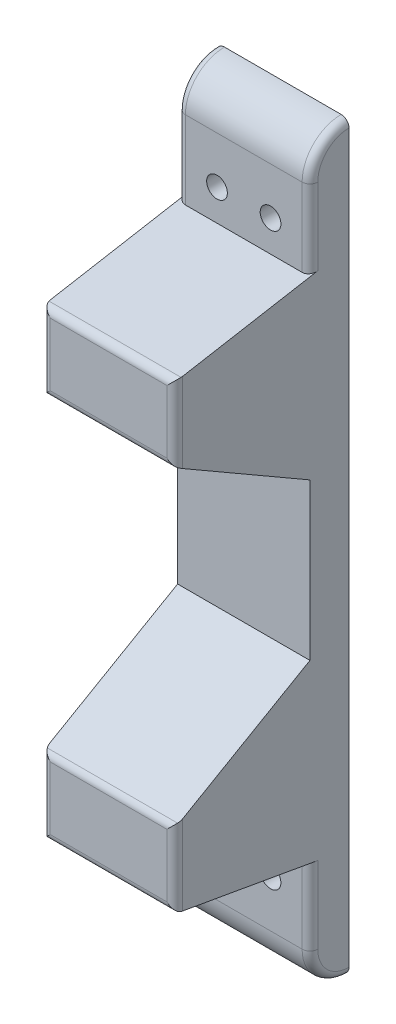
ISO-10303-21;
HEADER;
FILE_DESCRIPTION(('STEP AP214'),'2;1');
FILE_NAME('part.step','',(''),(''),'','','');
FILE_SCHEMA(('AUTOMOTIVE_DESIGN { 1 0 10303 214 1 1 1 1 }'));
ENDSEC;
DATA;
#1=APPLICATION_CONTEXT('core data for automotive mechanical design processes');
#2=APPLICATION_PROTOCOL_DEFINITION('international standard','automotive_design',2000,#1);
#3=PRODUCT_CONTEXT('',#1,'mechanical');
#4=PRODUCT('Part','Part','',(#3));
#5=PRODUCT_RELATED_PRODUCT_CATEGORY('part','',(#4));
#6=PRODUCT_DEFINITION_FORMATION('','',#4);
#7=PRODUCT_DEFINITION_CONTEXT('part definition',#1,'design');
#8=PRODUCT_DEFINITION('design','',#6,#7);
#9=PRODUCT_DEFINITION_SHAPE('','',#8);
#10=(LENGTH_UNIT() NAMED_UNIT(*) SI_UNIT(.MILLI.,.METRE.));
#11=(NAMED_UNIT(*) PLANE_ANGLE_UNIT() SI_UNIT($,.RADIAN.));
#12=(NAMED_UNIT(*) SI_UNIT($,.STERADIAN.) SOLID_ANGLE_UNIT());
#13=UNCERTAINTY_MEASURE_WITH_UNIT(LENGTH_MEASURE(1.E-05),#10,'distance_accuracy_value','');
#14=(GEOMETRIC_REPRESENTATION_CONTEXT(3) GLOBAL_UNCERTAINTY_ASSIGNED_CONTEXT((#13)) GLOBAL_UNIT_ASSIGNED_CONTEXT((#10,
#11,#12)) REPRESENTATION_CONTEXT('',''));
#15=CARTESIAN_POINT('',(0.,0.,0.));
#16=DIRECTION('',(0.,0.,1.));
#17=DIRECTION('',(1.,0.,0.));
#18=AXIS2_PLACEMENT_3D('',#15,#16,#17);
#19=CARTESIAN_POINT('',(0.,0.,10.));
#20=DIRECTION('',(0.,0.,-1.));
#21=DIRECTION('',(-1.,0.,0.));
#22=AXIS2_PLACEMENT_3D('',#19,#20,#21);
#23=PLANE('',#22);
#24=CARTESIAN_POINT('',(-6.85,-73.,10.));
#25=DIRECTION('',(0.,0.,1.));
#26=DIRECTION('',(-1.,0.,0.));
#27=AXIS2_PLACEMENT_3D('',#24,#25,#26);
#28=CIRCLE('',#27,2.65000000000001);
#29=CARTESIAN_POINT('',(-9.50000000000001,-73.,10.));
#30=VERTEX_POINT('',#29);
#31=EDGE_CURVE('E271',#30,#30,#28,.T.);
#32=ORIENTED_EDGE('',*,*,#31,.F.);
#33=EDGE_LOOP('',(#32));
#34=FACE_BOUND('',#33,.T.);
#35=CARTESIAN_POINT('',(6.85,-73.,10.));
#36=DIRECTION('',(0.,0.,1.));
#37=DIRECTION('',(1.,0.,0.));
#38=AXIS2_PLACEMENT_3D('',#35,#36,#37);
#39=CIRCLE('',#38,2.65000000000001);
#40=CARTESIAN_POINT('',(9.50000000000001,-73.,10.));
#41=VERTEX_POINT('',#40);
#42=EDGE_CURVE('E260',#41,#41,#39,.T.);
#43=ORIENTED_EDGE('',*,*,#42,.F.);
#44=EDGE_LOOP('',(#43));
#45=FACE_BOUND('',#44,.T.);
#46=DIRECTION('',(1.,0.,0.));
#47=VECTOR('',#46,1.);
#48=CARTESIAN_POINT('',(0.,-85.,10.));
#49=LINE('',#48,#47);
#50=CARTESIAN_POINT('',(-14.9328045684474,-85.,10.));
#51=VERTEX_POINT('',#50);
#52=CARTESIAN_POINT('',(14.9328045684475,-85.,10.));
#53=VERTEX_POINT('',#52);
#54=EDGE_CURVE('E315',#51,#53,#49,.T.);
#55=ORIENTED_EDGE('',*,*,#54,.T.);
#56=DIRECTION('',(0.,1.,0.));
#57=VECTOR('',#56,1.);
#58=CARTESIAN_POINT('',(14.9328045684475,0.,10.));
#59=LINE('',#58,#57);
#60=CARTESIAN_POINT('',(14.9328045684475,-65.,10.));
#61=VERTEX_POINT('',#60);
#62=EDGE_CURVE('E453',#53,#61,#59,.T.);
#63=ORIENTED_EDGE('',*,*,#62,.T.);
#64=DIRECTION('',(-1.,0.,0.));
#65=VECTOR('',#64,1.);
#66=CARTESIAN_POINT('',(16.9328045684475,-65.,10.));
#67=LINE('',#66,#65);
#68=CARTESIAN_POINT('',(-14.9328045684474,-65.,10.));
#69=VERTEX_POINT('',#68);
#70=EDGE_CURVE('E235',#61,#69,#67,.T.);
#71=ORIENTED_EDGE('',*,*,#70,.T.);
#72=DIRECTION('',(0.,-1.,0.));
#73=VECTOR('',#72,1.);
#74=CARTESIAN_POINT('',(-14.9328045684475,0.,10.));
#75=LINE('',#74,#73);
#76=EDGE_CURVE('E450',#69,#51,#75,.T.);
#77=ORIENTED_EDGE('',*,*,#76,.T.);
#78=EDGE_LOOP('',(#55,#63,#71,#77));
#79=FACE_BOUND('',#78,.T.);
#80=ADVANCED_FACE('F47',(#34,#45,#79),#23,.F.);
#81=DIRECTION('',(0.,-1.,0.));
#82=VECTOR('',#81,1.);
#83=CARTESIAN_POINT('',(-16.9328045684474,-95.,10.));
#84=LINE('',#83,#82);
#85=CARTESIAN_POINT('',(-16.9328045684475,20.,10.));
#86=VERTEX_POINT('',#85);
#87=CARTESIAN_POINT('',(-16.9328045684475,-20.,10.));
#88=VERTEX_POINT('',#87);
#89=EDGE_CURVE('E238',#86,#88,#84,.T.);
#90=ORIENTED_EDGE('',*,*,#89,.T.);
#91=DIRECTION('',(-1.,0.,0.));
#92=VECTOR('',#91,1.);
#93=CARTESIAN_POINT('',(16.9328045684475,-20.,10.));
#94=LINE('',#93,#92);
#95=CARTESIAN_POINT('',(16.9328045684475,-20.,10.));
#96=VERTEX_POINT('',#95);
#97=EDGE_CURVE('E537',#96,#88,#94,.T.);
#98=ORIENTED_EDGE('',*,*,#97,.F.);
#99=DIRECTION('',(0.,1.,0.));
#100=VECTOR('',#99,1.);
#101=CARTESIAN_POINT('',(16.9328045684475,-95.,10.));
#102=LINE('',#101,#100);
#103=CARTESIAN_POINT('',(16.9328045684475,20.,10.));
#104=VERTEX_POINT('',#103);
#105=EDGE_CURVE('E248',#96,#104,#102,.T.);
#106=ORIENTED_EDGE('',*,*,#105,.T.);
#107=DIRECTION('',(-1.,0.,0.));
#108=VECTOR('',#107,1.);
#109=CARTESIAN_POINT('',(16.9328045684475,20.,10.));
#110=LINE('',#109,#108);
#111=EDGE_CURVE('E227',#104,#86,#110,.T.);
#112=ORIENTED_EDGE('',*,*,#111,.T.);
#113=EDGE_LOOP('',(#90,#98,#106,#112));
#114=FACE_BOUND('',#113,.T.);
#115=ADVANCED_FACE('F251',(#114),#23,.F.);
#116=CARTESIAN_POINT('',(6.85,73.,10.));
#117=DIRECTION('',(0.,0.,1.));
#118=DIRECTION('',(-1.,0.,0.));
#119=AXIS2_PLACEMENT_3D('',#116,#117,#118);
#120=CIRCLE('',#119,2.65);
#121=CARTESIAN_POINT('',(4.2,73.,10.));
#122=VERTEX_POINT('',#121);
#123=EDGE_CURVE('E279',#122,#122,#120,.T.);
#124=ORIENTED_EDGE('',*,*,#123,.F.);
#125=EDGE_LOOP('',(#124));
#126=FACE_BOUND('',#125,.T.);
#127=CARTESIAN_POINT('',(-6.85,73.,10.));
#128=DIRECTION('',(0.,0.,1.));
#129=DIRECTION('',(1.,0.,0.));
#130=AXIS2_PLACEMENT_3D('',#127,#128,#129);
#131=CIRCLE('',#130,2.65);
#132=CARTESIAN_POINT('',(-4.2,73.,10.));
#133=VERTEX_POINT('',#132);
#134=EDGE_CURVE('E287',#133,#133,#131,.T.);
#135=ORIENTED_EDGE('',*,*,#134,.F.);
#136=EDGE_LOOP('',(#135));
#137=FACE_BOUND('',#136,.T.);
#138=DIRECTION('',(-1.,0.,0.));
#139=VECTOR('',#138,1.);
#140=CARTESIAN_POINT('',(0.,85.,10.));
#141=LINE('',#140,#139);
#142=CARTESIAN_POINT('',(14.9328045684475,85.,10.));
#143=VERTEX_POINT('',#142);
#144=CARTESIAN_POINT('',(-14.9328045684475,85.,10.));
#145=VERTEX_POINT('',#144);
#146=EDGE_CURVE('E247',#143,#145,#141,.T.);
#147=ORIENTED_EDGE('',*,*,#146,.T.);
#148=DIRECTION('',(0.,-1.,0.));
#149=VECTOR('',#148,1.);
#150=CARTESIAN_POINT('',(-14.9328045684475,0.,10.));
#151=LINE('',#150,#149);
#152=CARTESIAN_POINT('',(-14.9328045684475,65.,10.));
#153=VERTEX_POINT('',#152);
#154=EDGE_CURVE('E388',#145,#153,#151,.T.);
#155=ORIENTED_EDGE('',*,*,#154,.T.);
#156=DIRECTION('',(-1.,0.,0.));
#157=VECTOR('',#156,1.);
#158=CARTESIAN_POINT('',(16.9328045684475,65.,10.));
#159=LINE('',#158,#157);
#160=CARTESIAN_POINT('',(14.9328045684475,65.,10.));
#161=VERTEX_POINT('',#160);
#162=EDGE_CURVE('E255',#161,#153,#159,.T.);
#163=ORIENTED_EDGE('',*,*,#162,.F.);
#164=DIRECTION('',(0.,1.,0.));
#165=VECTOR('',#164,1.);
#166=CARTESIAN_POINT('',(14.9328045684475,0.,10.));
#167=LINE('',#166,#165);
#168=EDGE_CURVE('E385',#161,#143,#167,.T.);
#169=ORIENTED_EDGE('',*,*,#168,.T.);
#170=EDGE_LOOP('',(#147,#155,#163,#169));
#171=FACE_BOUND('',#170,.T.);
#172=ADVANCED_FACE('F629',(#126,#137,#171),#23,.F.);
#173=CARTESIAN_POINT('',(0.,0.,0.));
#174=DIRECTION('',(0.,0.,-1.));
#175=DIRECTION('',(-1.,0.,0.));
#176=AXIS2_PLACEMENT_3D('',#173,#174,#175);
#177=PLANE('',#176);
#178=CARTESIAN_POINT('',(-6.85,-73.,0.));
#179=DIRECTION('',(0.,0.,1.));
#180=DIRECTION('',(-1.,0.,0.));
#181=AXIS2_PLACEMENT_3D('',#178,#179,#180);
#182=CIRCLE('',#181,2.65000000000001);
#183=CARTESIAN_POINT('',(-9.50000000000001,-73.,0.));
#184=VERTEX_POINT('',#183);
#185=EDGE_CURVE('E269',#184,#184,#182,.T.);
#186=ORIENTED_EDGE('',*,*,#185,.T.);
#187=EDGE_LOOP('',(#186));
#188=FACE_BOUND('',#187,.T.);
#189=CARTESIAN_POINT('',(-6.85,73.,0.));
#190=DIRECTION('',(0.,0.,1.));
#191=DIRECTION('',(1.,0.,0.));
#192=AXIS2_PLACEMENT_3D('',#189,#190,#191);
#193=CIRCLE('',#192,2.65);
#194=CARTESIAN_POINT('',(-4.2,73.,0.));
#195=VERTEX_POINT('',#194);
#196=EDGE_CURVE('E283',#195,#195,#193,.T.);
#197=ORIENTED_EDGE('',*,*,#196,.T.);
#198=EDGE_LOOP('',(#197));
#199=FACE_BOUND('',#198,.T.);
#200=DIRECTION('',(0.,-1.,0.));
#201=VECTOR('',#200,1.);
#202=CARTESIAN_POINT('',(-16.9328045684474,-95.,0.));
#203=LINE('',#202,#201);
#204=CARTESIAN_POINT('',(-16.9328045684475,93.,0.));
#205=VERTEX_POINT('',#204);
#206=CARTESIAN_POINT('',(-16.9328045684474,-93.,0.));
#207=VERTEX_POINT('',#206);
#208=EDGE_CURVE('E305',#205,#207,#203,.T.);
#209=ORIENTED_EDGE('',*,*,#208,.F.);
#210=CARTESIAN_POINT('',(-14.9328045684475,93.,0.));
#211=DIRECTION('',(0.,0.,-1.));
#212=DIRECTION('',(-1.,0.,0.));
#213=AXIS2_PLACEMENT_3D('',#210,#211,#212);
#214=CIRCLE('',#213,2.);
#215=CARTESIAN_POINT('',(-14.9328045684475,95.,0.));
#216=VERTEX_POINT('',#215);
#217=EDGE_CURVE('E349',#205,#216,#214,.T.);
#218=ORIENTED_EDGE('',*,*,#217,.T.);
#219=DIRECTION('',(-1.,0.,0.));
#220=VECTOR('',#219,1.);
#221=CARTESIAN_POINT('',(-16.9328045684475,95.,0.));
#222=LINE('',#221,#220);
#223=CARTESIAN_POINT('',(14.9328045684475,95.,0.));
#224=VERTEX_POINT('',#223);
#225=EDGE_CURVE('E301',#224,#216,#222,.T.);
#226=ORIENTED_EDGE('',*,*,#225,.F.);
#227=CARTESIAN_POINT('',(14.9328045684475,93.,0.));
#228=DIRECTION('',(0.,0.,-1.));
#229=DIRECTION('',(-1.,0.,0.));
#230=AXIS2_PLACEMENT_3D('',#227,#228,#229);
#231=CIRCLE('',#230,2.);
#232=CARTESIAN_POINT('',(16.9328045684475,93.,0.));
#233=VERTEX_POINT('',#232);
#234=EDGE_CURVE('E346',#224,#233,#231,.T.);
#235=ORIENTED_EDGE('',*,*,#234,.T.);
#236=DIRECTION('',(0.,1.,0.));
#237=VECTOR('',#236,1.);
#238=CARTESIAN_POINT('',(16.9328045684475,-95.,0.));
#239=LINE('',#238,#237);
#240=CARTESIAN_POINT('',(16.9328045684475,-93.,0.));
#241=VERTEX_POINT('',#240);
#242=EDGE_CURVE('E291',#241,#233,#239,.T.);
#243=ORIENTED_EDGE('',*,*,#242,.F.);
#244=CARTESIAN_POINT('',(14.9328045684475,-93.,0.));
#245=DIRECTION('',(0.,0.,-1.));
#246=DIRECTION('',(-1.,0.,0.));
#247=AXIS2_PLACEMENT_3D('',#244,#245,#246);
#248=CIRCLE('',#247,2.);
#249=CARTESIAN_POINT('',(14.9328045684475,-95.,0.));
#250=VERTEX_POINT('',#249);
#251=EDGE_CURVE('E343',#241,#250,#248,.T.);
#252=ORIENTED_EDGE('',*,*,#251,.T.);
#253=DIRECTION('',(1.,0.,0.));
#254=VECTOR('',#253,1.);
#255=CARTESIAN_POINT('',(-16.9328045684474,-95.,0.));
#256=LINE('',#255,#254);
#257=CARTESIAN_POINT('',(-14.9328045684474,-95.,0.));
#258=VERTEX_POINT('',#257);
#259=EDGE_CURVE('E296',#258,#250,#256,.T.);
#260=ORIENTED_EDGE('',*,*,#259,.F.);
#261=CARTESIAN_POINT('',(-14.9328045684474,-93.,0.));
#262=DIRECTION('',(0.,0.,-1.));
#263=DIRECTION('',(-1.,0.,0.));
#264=AXIS2_PLACEMENT_3D('',#261,#262,#263);
#265=CIRCLE('',#264,2.);
#266=EDGE_CURVE('E340',#258,#207,#265,.T.);
#267=ORIENTED_EDGE('',*,*,#266,.T.);
#268=EDGE_LOOP('',(#209,#218,#226,#235,#243,#252,#260,#267));
#269=FACE_BOUND('',#268,.T.);
#270=CARTESIAN_POINT('',(6.85,73.,0.));
#271=DIRECTION('',(0.,0.,1.));
#272=DIRECTION('',(-1.,0.,0.));
#273=AXIS2_PLACEMENT_3D('',#270,#271,#272);
#274=CIRCLE('',#273,2.65);
#275=CARTESIAN_POINT('',(4.2,73.,0.));
#276=VERTEX_POINT('',#275);
#277=EDGE_CURVE('E275',#276,#276,#274,.T.);
#278=ORIENTED_EDGE('',*,*,#277,.T.);
#279=EDGE_LOOP('',(#278));
#280=FACE_BOUND('',#279,.T.);
#281=CARTESIAN_POINT('',(6.85,-73.,0.));
#282=DIRECTION('',(0.,0.,1.));
#283=DIRECTION('',(1.,0.,0.));
#284=AXIS2_PLACEMENT_3D('',#281,#282,#283);
#285=CIRCLE('',#284,2.65000000000001);
#286=CARTESIAN_POINT('',(9.50000000000001,-73.,0.));
#287=VERTEX_POINT('',#286);
#288=EDGE_CURVE('E254',#287,#287,#285,.T.);
#289=ORIENTED_EDGE('',*,*,#288,.T.);
#290=EDGE_LOOP('',(#289));
#291=FACE_BOUND('',#290,.T.);
#292=ADVANCED_FACE('F593',(#188,#199,#269,#280,#291),#177,.T.);
#293=CARTESIAN_POINT('',(16.9328045684475,-95.,10.));
#294=DIRECTION('',(-1.,0.,0.));
#295=DIRECTION('',(0.,0.,1.));
#296=AXIS2_PLACEMENT_3D('',#293,#294,#295);
#297=PLANE('',#296);
#298=ORIENTED_EDGE('',*,*,#242,.T.);
#299=CARTESIAN_POINT('',(16.9328045684475,85.,0.));
#300=DIRECTION('',(-1.,0.,0.));
#301=DIRECTION('',(0.,0.,1.));
#302=AXIS2_PLACEMENT_3D('',#299,#300,#301);
#303=CIRCLE('',#302,8.);
#304=CARTESIAN_POINT('',(16.9328045684475,85.,8.));
#305=VERTEX_POINT('',#304);
#306=EDGE_CURVE('E375',#233,#305,#303,.F.);
#307=ORIENTED_EDGE('',*,*,#306,.T.);
#308=DIRECTION('',(0.,1.,0.));
#309=VECTOR('',#308,1.);
#310=CARTESIAN_POINT('',(16.9328045684475,-95.,8.));
#311=LINE('',#310,#309);
#312=CARTESIAN_POINT('',(16.9328045684475,65.3526539614169,8.));
#313=VERTEX_POINT('',#312);
#314=EDGE_CURVE('E371',#305,#313,#311,.F.);
#315=ORIENTED_EDGE('',*,*,#314,.T.);
#316=DIRECTION('',(0.,-0.173648177666934,0.984807753012207));
#317=VECTOR('',#316,1.);
#318=CARTESIAN_POINT('',(16.9328045684475,64.7501108921703,11.4171915541549));
#319=LINE('',#318,#317);
#320=CARTESIAN_POINT('',(16.9328045684475,59.2517404289039,42.6));
#321=VERTEX_POINT('',#320);
#322=EDGE_CURVE('E263',#313,#321,#319,.T.);
#323=ORIENTED_EDGE('',*,*,#322,.T.);
#324=DIRECTION('',(0.,-1.,0.));
#325=VECTOR('',#324,1.);
#326=CARTESIAN_POINT('',(16.9328045684475,-95.,42.6));
#327=LINE('',#326,#325);
#328=CARTESIAN_POINT('',(16.9328045684475,38.821618775582,42.6));
#329=VERTEX_POINT('',#328);
#330=EDGE_CURVE('E368',#321,#329,#327,.T.);
#331=ORIENTED_EDGE('',*,*,#330,.T.);
#332=DIRECTION('',(0.,-0.500000000000005,-0.866025403784436));
#333=VECTOR('',#332,1.);
#334=CARTESIAN_POINT('',(16.9328045684475,10.6698729810777,-6.16025403784439));
#335=LINE('',#334,#333);
#336=EDGE_CURVE('E553',#329,#104,#335,.T.);
#337=ORIENTED_EDGE('',*,*,#336,.T.);
#338=ORIENTED_EDGE('',*,*,#105,.F.);
#339=DIRECTION('',(0.,0.500000000000005,-0.866025403784436));
#340=VECTOR('',#339,1.);
#341=CARTESIAN_POINT('',(16.9328045684475,-10.6698729810777,-6.16025403784439));
#342=LINE('',#341,#340);
#343=CARTESIAN_POINT('',(16.9328045684475,-38.821618775582,42.6));
#344=VERTEX_POINT('',#343);
#345=EDGE_CURVE('E531',#344,#96,#342,.T.);
#346=ORIENTED_EDGE('',*,*,#345,.F.);
#347=DIRECTION('',(0.,1.,0.));
#348=VECTOR('',#347,1.);
#349=CARTESIAN_POINT('',(16.9328045684475,-58.899086467487,42.6));
#350=LINE('',#349,#348);
#351=CARTESIAN_POINT('',(16.9328045684475,-59.2517404289039,42.6));
#352=VERTEX_POINT('',#351);
#353=EDGE_CURVE('E365',#344,#352,#350,.F.);
#354=ORIENTED_EDGE('',*,*,#353,.T.);
#355=DIRECTION('',(0.,0.173648177666934,0.984807753012208));
#356=VECTOR('',#355,1.);
#357=CARTESIAN_POINT('',(16.9328045684475,-64.7501108921703,11.4171915541549));
#358=LINE('',#357,#356);
#359=CARTESIAN_POINT('',(16.9328045684475,-65.3526539614169,8.));
#360=VERTEX_POINT('',#359);
#361=EDGE_CURVE('E530',#360,#352,#358,.T.);
#362=ORIENTED_EDGE('',*,*,#361,.F.);
#363=DIRECTION('',(0.,1.,0.));
#364=VECTOR('',#363,1.);
#365=CARTESIAN_POINT('',(16.9328045684475,-95.,8.));
#366=LINE('',#365,#364);
#367=CARTESIAN_POINT('',(16.9328045684475,-85.,8.));
#368=VERTEX_POINT('',#367);
#369=EDGE_CURVE('E358',#360,#368,#366,.F.);
#370=ORIENTED_EDGE('',*,*,#369,.T.);
#371=CARTESIAN_POINT('',(16.9328045684475,-85.,0.));
#372=DIRECTION('',(-1.,0.,0.));
#373=DIRECTION('',(0.,0.,1.));
#374=AXIS2_PLACEMENT_3D('',#371,#372,#373);
#375=CIRCLE('',#374,8.);
#376=EDGE_CURVE('E361',#368,#241,#375,.F.);
#377=ORIENTED_EDGE('',*,*,#376,.T.);
#378=EDGE_LOOP('',(#298,#307,#315,#323,#331,#337,#338,#346,#354,#362,#370,#377));
#379=FACE_BOUND('',#378,.T.);
#380=ADVANCED_FACE('F529',(#379),#297,.F.);
#381=CARTESIAN_POINT('',(-16.9328045684474,-95.,10.));
#382=DIRECTION('',(1.,0.,0.));
#383=DIRECTION('',(0.,1.,0.));
#384=AXIS2_PLACEMENT_3D('',#381,#382,#383);
#385=PLANE('',#384);
#386=DIRECTION('',(0.,-1.,0.));
#387=VECTOR('',#386,1.);
#388=CARTESIAN_POINT('',(-16.9328045684474,-95.,8.));
#389=LINE('',#388,#387);
#390=CARTESIAN_POINT('',(-16.9328045684475,65.3526539614169,8.));
#391=VERTEX_POINT('',#390);
#392=CARTESIAN_POINT('',(-16.9328045684475,85.,8.));
#393=VERTEX_POINT('',#392);
#394=EDGE_CURVE('E333',#391,#393,#389,.F.);
#395=ORIENTED_EDGE('',*,*,#394,.T.);
#396=CARTESIAN_POINT('',(-16.9328045684475,85.,0.));
#397=DIRECTION('',(1.,0.,0.));
#398=DIRECTION('',(0.,1.,0.));
#399=AXIS2_PLACEMENT_3D('',#396,#397,#398);
#400=CIRCLE('',#399,8.);
#401=EDGE_CURVE('E336',#393,#205,#400,.F.);
#402=ORIENTED_EDGE('',*,*,#401,.T.);
#403=ORIENTED_EDGE('',*,*,#208,.T.);
#404=CARTESIAN_POINT('',(-16.9328045684474,-85.,0.));
#405=DIRECTION('',(1.,0.,0.));
#406=DIRECTION('',(0.,1.,0.));
#407=AXIS2_PLACEMENT_3D('',#404,#405,#406);
#408=CIRCLE('',#407,8.);
#409=CARTESIAN_POINT('',(-16.9328045684474,-85.,8.));
#410=VERTEX_POINT('',#409);
#411=EDGE_CURVE('E323',#207,#410,#408,.F.);
#412=ORIENTED_EDGE('',*,*,#411,.T.);
#413=DIRECTION('',(0.,-1.,0.));
#414=VECTOR('',#413,1.);
#415=CARTESIAN_POINT('',(-16.9328045684474,-95.,8.));
#416=LINE('',#415,#414);
#417=CARTESIAN_POINT('',(-16.9328045684474,-65.3526539614169,8.));
#418=VERTEX_POINT('',#417);
#419=EDGE_CURVE('E319',#410,#418,#416,.F.);
#420=ORIENTED_EDGE('',*,*,#419,.T.);
#421=DIRECTION('',(0.,0.173648177666934,0.984807753012208));
#422=VECTOR('',#421,1.);
#423=CARTESIAN_POINT('',(-16.9328045684474,-64.7501108921703,11.4171915541549));
#424=LINE('',#423,#422);
#425=CARTESIAN_POINT('',(-16.9328045684474,-59.2517404289039,42.6));
#426=VERTEX_POINT('',#425);
#427=EDGE_CURVE('E542',#418,#426,#424,.T.);
#428=ORIENTED_EDGE('',*,*,#427,.T.);
#429=DIRECTION('',(0.,1.,0.));
#430=VECTOR('',#429,1.);
#431=CARTESIAN_POINT('',(-16.9328045684474,-39.9763193139613,42.6));
#432=LINE('',#431,#430);
#433=CARTESIAN_POINT('',(-16.9328045684474,-38.821618775582,42.6));
#434=VERTEX_POINT('',#433);
#435=EDGE_CURVE('E327',#426,#434,#432,.T.);
#436=ORIENTED_EDGE('',*,*,#435,.T.);
#437=DIRECTION('',(0.,0.500000000000005,-0.866025403784436));
#438=VECTOR('',#437,1.);
#439=CARTESIAN_POINT('',(-16.9328045684475,-10.6698729810777,-6.16025403784439));
#440=LINE('',#439,#438);
#441=EDGE_CURVE('E242',#434,#88,#440,.T.);
#442=ORIENTED_EDGE('',*,*,#441,.T.);
#443=ORIENTED_EDGE('',*,*,#89,.F.);
#444=DIRECTION('',(0.,-0.500000000000005,-0.866025403784436));
#445=VECTOR('',#444,1.);
#446=CARTESIAN_POINT('',(-16.9328045684475,10.6698729810777,-6.16025403784439));
#447=LINE('',#446,#445);
#448=CARTESIAN_POINT('',(-16.9328045684475,38.821618775582,42.6));
#449=VERTEX_POINT('',#448);
#450=EDGE_CURVE('E222',#449,#86,#447,.T.);
#451=ORIENTED_EDGE('',*,*,#450,.F.);
#452=DIRECTION('',(0.,-1.,0.));
#453=VECTOR('',#452,1.);
#454=CARTESIAN_POINT('',(-16.9328045684474,-95.,42.6));
#455=LINE('',#454,#453);
#456=CARTESIAN_POINT('',(-16.9328045684475,59.2517404289039,42.6));
#457=VERTEX_POINT('',#456);
#458=EDGE_CURVE('E330',#449,#457,#455,.F.);
#459=ORIENTED_EDGE('',*,*,#458,.T.);
#460=DIRECTION('',(0.,-0.173648177666934,0.984807753012207));
#461=VECTOR('',#460,1.);
#462=CARTESIAN_POINT('',(-16.9328045684475,64.7501108921703,11.4171915541549));
#463=LINE('',#462,#461);
#464=EDGE_CURVE('E234',#391,#457,#463,.T.);
#465=ORIENTED_EDGE('',*,*,#464,.F.);
#466=EDGE_LOOP('',(#395,#402,#403,#412,#420,#428,#436,#442,#443,#451,#459,#465));
#467=FACE_BOUND('',#466,.T.);
#468=ADVANCED_FACE('F239',(#467),#385,.F.);
#469=CARTESIAN_POINT('',(-6.85,73.,10.));
#470=DIRECTION('',(0.,0.,-1.));
#471=DIRECTION('',(-1.,0.,0.));
#472=AXIS2_PLACEMENT_3D('',#469,#470,#471);
#473=CYLINDRICAL_SURFACE('',#472,2.65);
#474=ORIENTED_EDGE('',*,*,#134,.T.);
#475=EDGE_LOOP('',(#474));
#476=FACE_BOUND('',#475,.T.);
#477=ORIENTED_EDGE('',*,*,#196,.F.);
#478=EDGE_LOOP('',(#477));
#479=FACE_BOUND('',#478,.T.);
#480=ADVANCED_FACE('F667',(#476,#479),#473,.F.);
#481=CARTESIAN_POINT('',(6.85,73.,10.));
#482=DIRECTION('',(0.,0.,-1.));
#483=DIRECTION('',(-1.,0.,0.));
#484=AXIS2_PLACEMENT_3D('',#481,#482,#483);
#485=CYLINDRICAL_SURFACE('',#484,2.65);
#486=ORIENTED_EDGE('',*,*,#123,.T.);
#487=EDGE_LOOP('',(#486));
#488=FACE_BOUND('',#487,.T.);
#489=ORIENTED_EDGE('',*,*,#277,.F.);
#490=EDGE_LOOP('',(#489));
#491=FACE_BOUND('',#490,.T.);
#492=ADVANCED_FACE('F670',(#488,#491),#485,.F.);
#493=CARTESIAN_POINT('',(-6.85,-73.,10.));
#494=DIRECTION('',(0.,0.,-1.));
#495=DIRECTION('',(-1.,0.,0.));
#496=AXIS2_PLACEMENT_3D('',#493,#494,#495);
#497=CYLINDRICAL_SURFACE('',#496,2.65000000000001);
#498=ORIENTED_EDGE('',*,*,#31,.T.);
#499=EDGE_LOOP('',(#498));
#500=FACE_BOUND('',#499,.T.);
#501=ORIENTED_EDGE('',*,*,#185,.F.);
#502=EDGE_LOOP('',(#501));
#503=FACE_BOUND('',#502,.T.);
#504=ADVANCED_FACE('F677',(#500,#503),#497,.F.);
#505=CARTESIAN_POINT('',(6.85,-73.,10.));
#506=DIRECTION('',(0.,0.,-1.));
#507=DIRECTION('',(-1.,0.,0.));
#508=AXIS2_PLACEMENT_3D('',#505,#506,#507);
#509=CYLINDRICAL_SURFACE('',#508,2.65000000000001);
#510=ORIENTED_EDGE('',*,*,#42,.T.);
#511=EDGE_LOOP('',(#510));
#512=FACE_BOUND('',#511,.T.);
#513=ORIENTED_EDGE('',*,*,#288,.F.);
#514=EDGE_LOOP('',(#513));
#515=FACE_BOUND('',#514,.T.);
#516=ADVANCED_FACE('F643',(#512,#515),#509,.F.);
#517=CARTESIAN_POINT('',(0.,-85.,0.));
#518=DIRECTION('',(1.,0.,0.));
#519=DIRECTION('',(0.,0.,-1.));
#520=AXIS2_PLACEMENT_3D('',#517,#518,#519);
#521=CYLINDRICAL_SURFACE('',#520,10.);
#522=ORIENTED_EDGE('',*,*,#259,.T.);
#523=CARTESIAN_POINT('',(14.9328045684475,-85.,0.));
#524=DIRECTION('',(-1.,0.,0.));
#525=DIRECTION('',(0.,0.,1.));
#526=AXIS2_PLACEMENT_3D('',#523,#524,#525);
#527=CIRCLE('',#526,10.);
#528=EDGE_CURVE('E382',#250,#53,#527,.T.);
#529=ORIENTED_EDGE('',*,*,#528,.T.);
#530=ORIENTED_EDGE('',*,*,#54,.F.);
#531=CARTESIAN_POINT('',(-14.9328045684474,-85.,0.));
#532=DIRECTION('',(1.,0.,0.));
#533=DIRECTION('',(0.,1.,0.));
#534=AXIS2_PLACEMENT_3D('',#531,#532,#533);
#535=CIRCLE('',#534,10.);
#536=EDGE_CURVE('E379',#51,#258,#535,.T.);
#537=ORIENTED_EDGE('',*,*,#536,.T.);
#538=EDGE_LOOP('',(#522,#529,#530,#537));
#539=FACE_BOUND('',#538,.T.);
#540=ADVANCED_FACE('F636',(#539),#521,.T.);
#541=CARTESIAN_POINT('',(0.,85.,0.));
#542=DIRECTION('',(-1.,0.,0.));
#543=DIRECTION('',(0.,0.,1.));
#544=AXIS2_PLACEMENT_3D('',#541,#542,#543);
#545=CYLINDRICAL_SURFACE('',#544,10.);
#546=ORIENTED_EDGE('',*,*,#225,.T.);
#547=CARTESIAN_POINT('',(-14.9328045684475,85.,0.));
#548=DIRECTION('',(1.,0.,0.));
#549=DIRECTION('',(0.,1.,0.));
#550=AXIS2_PLACEMENT_3D('',#547,#548,#549);
#551=CIRCLE('',#550,10.);
#552=EDGE_CURVE('E355',#216,#145,#551,.T.);
#553=ORIENTED_EDGE('',*,*,#552,.T.);
#554=ORIENTED_EDGE('',*,*,#146,.F.);
#555=CARTESIAN_POINT('',(14.9328045684475,85.,0.));
#556=DIRECTION('',(-1.,0.,0.));
#557=DIRECTION('',(0.,0.,1.));
#558=AXIS2_PLACEMENT_3D('',#555,#556,#557);
#559=CIRCLE('',#558,10.);
#560=EDGE_CURVE('E352',#143,#224,#559,.T.);
#561=ORIENTED_EDGE('',*,*,#560,.T.);
#562=EDGE_LOOP('',(#546,#553,#554,#561));
#563=FACE_BOUND('',#562,.T.);
#564=ADVANCED_FACE('F634',(#563),#545,.T.);
#565=CARTESIAN_POINT('',(16.9328045684475,10.6698729810777,-6.16025403784439));
#566=DIRECTION('',(0.,0.866025403784436,-0.500000000000005));
#567=DIRECTION('',(0.,0.500000000000005,0.866025403784436));
#568=AXIS2_PLACEMENT_3D('',#565,#566,#567);
#569=PLANE('',#568);
#570=DIRECTION('',(-1.,0.,0.));
#571=VECTOR('',#570,1.);
#572=CARTESIAN_POINT('',(16.9328045684475,39.3989690447717,43.6));
#573=LINE('',#572,#571);
#574=CARTESIAN_POINT('',(16.6648553760165,39.3989690447717,43.6));
#575=VERTEX_POINT('',#574);
#576=CARTESIAN_POINT('',(-16.6648553760164,39.3989690447717,43.6));
#577=VERTEX_POINT('',#576);
#578=EDGE_CURVE('E407',#575,#577,#573,.T.);
#579=ORIENTED_EDGE('',*,*,#578,.T.);
#580=CARTESIAN_POINT('',(-14.9328045684475,38.821618775582,42.6));
#581=DIRECTION('',(0.,0.866025403784436,-0.500000000000005));
#582=DIRECTION('',(0.,-0.500000000000005,-0.866025403784436));
#583=AXIS2_PLACEMENT_3D('',#580,#581,#582);
#584=ELLIPSE('',#583,2.30940107675851,2.);
#585=EDGE_CURVE('E229',#577,#449,#584,.F.);
#586=ORIENTED_EDGE('',*,*,#585,.T.);
#587=ORIENTED_EDGE('',*,*,#450,.T.);
#588=ORIENTED_EDGE('',*,*,#111,.F.);
#589=ORIENTED_EDGE('',*,*,#336,.F.);
#590=CARTESIAN_POINT('',(14.9328045684475,38.821618775582,42.6));
#591=DIRECTION('',(0.,0.866025403784436,-0.500000000000005));
#592=DIRECTION('',(0.,-0.500000000000005,-0.866025403784436));
#593=AXIS2_PLACEMENT_3D('',#590,#591,#592);
#594=ELLIPSE('',#593,2.30940107675851,2.);
#595=EDGE_CURVE('E404',#329,#575,#594,.F.);
#596=ORIENTED_EDGE('',*,*,#595,.T.);
#597=EDGE_LOOP('',(#579,#586,#587,#588,#589,#596));
#598=FACE_BOUND('',#597,.T.);
#599=ADVANCED_FACE('F224',(#598),#569,.F.);
#600=CARTESIAN_POINT('',(16.9328045684475,64.7501108921703,11.4171915541549));
#601=DIRECTION('',(0.,-0.984807753012207,-0.173648177666934));
#602=DIRECTION('',(0.,0.173648177666934,-0.984807753012207));
#603=AXIS2_PLACEMENT_3D('',#600,#601,#602);
#604=PLANE('',#603);
#605=ORIENTED_EDGE('',*,*,#464,.T.);
#606=CARTESIAN_POINT('',(-14.9328045684475,59.2517404289039,42.6));
#607=DIRECTION('',(0.,-0.984807753012207,-0.173648177666934));
#608=DIRECTION('',(0.,-0.173648177666934,0.984807753012208));
#609=AXIS2_PLACEMENT_3D('',#606,#607,#608);
#610=ELLIPSE('',#609,2.03085322377149,2.);
#611=CARTESIAN_POINT('',(-16.9024200744719,59.1905027111568,42.9472963553339));
#612=VERTEX_POINT('',#611);
#613=EDGE_CURVE('E418',#457,#612,#610,.F.);
#614=ORIENTED_EDGE('',*,*,#613,.T.);
#615=DIRECTION('',(-1.,0.,0.));
#616=VECTOR('',#615,1.);
#617=CARTESIAN_POINT('',(16.9328045684475,59.1905027111568,42.9472963553339));
#618=LINE('',#617,#616);
#619=CARTESIAN_POINT('',(16.9024200744719,59.1905027111568,42.9472963553339));
#620=VERTEX_POINT('',#619);
#621=EDGE_CURVE('E415',#612,#620,#618,.F.);
#622=ORIENTED_EDGE('',*,*,#621,.T.);
#623=CARTESIAN_POINT('',(14.9328045684475,59.2517404289039,42.6));
#624=DIRECTION('',(0.,-0.984807753012207,-0.173648177666934));
#625=DIRECTION('',(0.,-0.173648177666934,0.984807753012208));
#626=AXIS2_PLACEMENT_3D('',#623,#624,#625);
#627=ELLIPSE('',#626,2.03085322377149,2.);
#628=EDGE_CURVE('E412',#620,#321,#627,.F.);
#629=ORIENTED_EDGE('',*,*,#628,.T.);
#630=ORIENTED_EDGE('',*,*,#322,.F.);
#631=CARTESIAN_POINT('',(14.9328045684475,65.352653961417,8.));
#632=DIRECTION('',(0.,-0.984807753012207,-0.173648177666934));
#633=DIRECTION('',(0.,0.173648177666934,-0.984807753012208));
#634=AXIS2_PLACEMENT_3D('',#631,#632,#633);
#635=ELLIPSE('',#634,2.03085322377149,2.);
#636=EDGE_CURVE('E460',#313,#161,#635,.T.);
#637=ORIENTED_EDGE('',*,*,#636,.T.);
#638=ORIENTED_EDGE('',*,*,#162,.T.);
#639=CARTESIAN_POINT('',(-14.9328045684475,65.352653961417,8.));
#640=DIRECTION('',(0.,-0.984807753012207,-0.173648177666934));
#641=DIRECTION('',(0.,-0.173648177666934,0.984807753012208));
#642=AXIS2_PLACEMENT_3D('',#639,#640,#641);
#643=ELLIPSE('',#642,2.03085322377149,2.);
#644=EDGE_CURVE('E456',#153,#391,#643,.T.);
#645=ORIENTED_EDGE('',*,*,#644,.T.);
#646=EDGE_LOOP('',(#605,#614,#622,#629,#630,#637,#638,#645));
#647=FACE_BOUND('',#646,.T.);
#648=ADVANCED_FACE('F578',(#647),#604,.F.);
#649=CARTESIAN_POINT('',(16.9328045684475,0.,44.6));
#650=DIRECTION('',(0.,0.,-1.));
#651=DIRECTION('',(-1.,0.,0.));
#652=AXIS2_PLACEMENT_3D('',#649,#650,#651);
#653=PLANE('',#652);
#654=DIRECTION('',(-1.,0.,0.));
#655=VECTOR('',#654,1.);
#656=CARTESIAN_POINT('',(16.9328045684475,57.2208872051324,44.6));
#657=LINE('',#656,#655);
#658=CARTESIAN_POINT('',(14.9328045684475,57.2208872051324,44.6));
#659=VERTEX_POINT('',#658);
#660=CARTESIAN_POINT('',(-14.9328045684475,57.2208872051324,44.6));
#661=VERTEX_POINT('',#660);
#662=EDGE_CURVE('E394',#659,#661,#657,.T.);
#663=ORIENTED_EDGE('',*,*,#662,.T.);
#664=DIRECTION('',(0.,-1.,0.));
#665=VECTOR('',#664,1.);
#666=CARTESIAN_POINT('',(-14.9328045684475,0.,44.6));
#667=LINE('',#666,#665);
#668=CARTESIAN_POINT('',(-14.9328045684475,41.1310198523405,44.6));
#669=VERTEX_POINT('',#668);
#670=EDGE_CURVE('E400',#661,#669,#667,.T.);
#671=ORIENTED_EDGE('',*,*,#670,.T.);
#672=DIRECTION('',(-1.,0.,0.));
#673=VECTOR('',#672,1.);
#674=CARTESIAN_POINT('',(16.9328045684475,41.1310198523405,44.6));
#675=LINE('',#674,#673);
#676=CARTESIAN_POINT('',(14.9328045684475,41.1310198523405,44.6));
#677=VERTEX_POINT('',#676);
#678=EDGE_CURVE('E397',#669,#677,#675,.F.);
#679=ORIENTED_EDGE('',*,*,#678,.T.);
#680=DIRECTION('',(0.,-1.,0.));
#681=VECTOR('',#680,1.);
#682=CARTESIAN_POINT('',(14.9328045684475,0.,44.6));
#683=LINE('',#682,#681);
#684=EDGE_CURVE('E391',#677,#659,#683,.F.);
#685=ORIENTED_EDGE('',*,*,#684,.T.);
#686=EDGE_LOOP('',(#663,#671,#679,#685));
#687=FACE_BOUND('',#686,.T.);
#688=ADVANCED_FACE('F688',(#687),#653,.F.);
#689=CARTESIAN_POINT('',(16.9328045684475,0.,44.6));
#690=DIRECTION('',(0.,0.,1.));
#691=DIRECTION('',(1.,0.,0.));
#692=AXIS2_PLACEMENT_3D('',#689,#690,#691);
#693=PLANE('',#692);
#694=DIRECTION('',(0.,1.,0.));
#695=VECTOR('',#694,1.);
#696=CARTESIAN_POINT('',(14.9328045684475,-39.9763193139613,44.6));
#697=LINE('',#696,#695);
#698=CARTESIAN_POINT('',(14.9328045684475,-57.2208872051324,44.6));
#699=VERTEX_POINT('',#698);
#700=CARTESIAN_POINT('',(14.9328045684475,-41.1310198523405,44.6));
#701=VERTEX_POINT('',#700);
#702=EDGE_CURVE('E433',#699,#701,#697,.T.);
#703=ORIENTED_EDGE('',*,*,#702,.T.);
#704=DIRECTION('',(-1.,0.,0.));
#705=VECTOR('',#704,1.);
#706=CARTESIAN_POINT('',(16.9328045684475,-41.1310198523405,44.6));
#707=LINE('',#706,#705);
#708=CARTESIAN_POINT('',(-14.9328045684474,-41.1310198523405,44.6));
#709=VERTEX_POINT('',#708);
#710=EDGE_CURVE('E440',#701,#709,#707,.T.);
#711=ORIENTED_EDGE('',*,*,#710,.T.);
#712=DIRECTION('',(0.,1.,0.));
#713=VECTOR('',#712,1.);
#714=CARTESIAN_POINT('',(-14.9328045684474,-58.899086467487,44.6));
#715=LINE('',#714,#713);
#716=CARTESIAN_POINT('',(-14.9328045684474,-57.2208872051324,44.6));
#717=VERTEX_POINT('',#716);
#718=EDGE_CURVE('E436',#709,#717,#715,.F.);
#719=ORIENTED_EDGE('',*,*,#718,.T.);
#720=DIRECTION('',(-1.,0.,0.));
#721=VECTOR('',#720,1.);
#722=CARTESIAN_POINT('',(16.9328045684475,-57.2208872051324,44.6));
#723=LINE('',#722,#721);
#724=EDGE_CURVE('E430',#717,#699,#723,.F.);
#725=ORIENTED_EDGE('',*,*,#724,.T.);
#726=EDGE_LOOP('',(#703,#711,#719,#725));
#727=FACE_BOUND('',#726,.T.);
#728=ADVANCED_FACE('F518',(#727),#693,.T.);
#729=CARTESIAN_POINT('',(16.9328045684475,-64.7501108921703,11.4171915541549));
#730=DIRECTION('',(0.,-0.984807753012207,0.173648177666934));
#731=DIRECTION('',(0.,-0.173648177666934,-0.984807753012207));
#732=AXIS2_PLACEMENT_3D('',#729,#730,#731);
#733=PLANE('',#732);
#734=DIRECTION('',(-1.,0.,0.));
#735=VECTOR('',#734,1.);
#736=CARTESIAN_POINT('',(16.9328045684475,-59.1905027111568,42.9472963553339));
#737=LINE('',#736,#735);
#738=CARTESIAN_POINT('',(16.9024200744719,-59.1905027111568,42.9472963553339));
#739=VERTEX_POINT('',#738);
#740=CARTESIAN_POINT('',(-16.9024200744719,-59.1905027111568,42.9472963553339));
#741=VERTEX_POINT('',#740);
#742=EDGE_CURVE('E65',#739,#741,#737,.T.);
#743=ORIENTED_EDGE('',*,*,#742,.T.);
#744=CARTESIAN_POINT('',(-14.9328045684474,-59.2517404289039,42.6));
#745=DIRECTION('',(0.,-0.984807753012207,0.173648177666934));
#746=DIRECTION('',(0.,-0.173648177666934,-0.984807753012207));
#747=AXIS2_PLACEMENT_3D('',#744,#745,#746);
#748=ELLIPSE('',#747,2.03085322377149,2.);
#749=EDGE_CURVE('E447',#741,#426,#748,.T.);
#750=ORIENTED_EDGE('',*,*,#749,.T.);
#751=ORIENTED_EDGE('',*,*,#427,.F.);
#752=CARTESIAN_POINT('',(-14.9328045684474,-65.3526539614169,8.));
#753=DIRECTION('',(0.,-0.984807753012207,0.173648177666934));
#754=DIRECTION('',(0.,-0.173648177666934,-0.984807753012207));
#755=AXIS2_PLACEMENT_3D('',#752,#753,#754);
#756=ELLIPSE('',#755,2.03085322377149,2.);
#757=EDGE_CURVE('E11',#418,#69,#756,.F.);
#758=ORIENTED_EDGE('',*,*,#757,.T.);
#759=ORIENTED_EDGE('',*,*,#70,.F.);
#760=CARTESIAN_POINT('',(14.9328045684475,-65.3526539614169,8.));
#761=DIRECTION('',(0.,-0.984807753012207,0.173648177666934));
#762=DIRECTION('',(0.,0.173648177666934,0.984807753012207));
#763=AXIS2_PLACEMENT_3D('',#760,#761,#762);
#764=ELLIPSE('',#763,2.03085322377149,2.);
#765=EDGE_CURVE('E57',#61,#360,#764,.F.);
#766=ORIENTED_EDGE('',*,*,#765,.T.);
#767=ORIENTED_EDGE('',*,*,#361,.T.);
#768=CARTESIAN_POINT('',(14.9328045684475,-59.2517404289039,42.6));
#769=DIRECTION('',(0.,-0.984807753012207,0.173648177666934));
#770=DIRECTION('',(0.,-0.173648177666934,-0.984807753012207));
#771=AXIS2_PLACEMENT_3D('',#768,#769,#770);
#772=ELLIPSE('',#771,2.03085322377149,2.);
#773=EDGE_CURVE('E70',#352,#739,#772,.T.);
#774=ORIENTED_EDGE('',*,*,#773,.T.);
#775=EDGE_LOOP('',(#743,#750,#751,#758,#759,#766,#767,#774));
#776=FACE_BOUND('',#775,.T.);
#777=ADVANCED_FACE('F532',(#776),#733,.T.);
#778=CARTESIAN_POINT('',(16.9328045684475,-10.6698729810777,-6.16025403784439));
#779=DIRECTION('',(0.,0.866025403784436,0.500000000000005));
#780=DIRECTION('',(0.,-0.500000000000005,0.866025403784436));
#781=AXIS2_PLACEMENT_3D('',#778,#779,#780);
#782=PLANE('',#781);
#783=ORIENTED_EDGE('',*,*,#441,.F.);
#784=CARTESIAN_POINT('',(-14.9328045684474,-38.821618775582,42.6));
#785=DIRECTION('',(0.,0.866025403784436,0.500000000000005));
#786=DIRECTION('',(0.,-0.500000000000005,0.866025403784436));
#787=AXIS2_PLACEMENT_3D('',#784,#785,#786);
#788=ELLIPSE('',#787,2.30940107675851,2.);
#789=CARTESIAN_POINT('',(-16.6648553760164,-39.3989690447717,43.6));
#790=VERTEX_POINT('',#789);
#791=EDGE_CURVE('E427',#434,#790,#788,.T.);
#792=ORIENTED_EDGE('',*,*,#791,.T.);
#793=DIRECTION('',(-1.,0.,0.));
#794=VECTOR('',#793,1.);
#795=CARTESIAN_POINT('',(16.9328045684475,-39.3989690447717,43.6));
#796=LINE('',#795,#794);
#797=CARTESIAN_POINT('',(16.6648553760164,-39.3989690447717,43.6));
#798=VERTEX_POINT('',#797);
#799=EDGE_CURVE('E421',#790,#798,#796,.F.);
#800=ORIENTED_EDGE('',*,*,#799,.T.);
#801=CARTESIAN_POINT('',(14.9328045684475,-38.821618775582,42.6));
#802=DIRECTION('',(0.,0.866025403784436,0.500000000000005));
#803=DIRECTION('',(0.,-0.500000000000005,0.866025403784436));
#804=AXIS2_PLACEMENT_3D('',#801,#802,#803);
#805=ELLIPSE('',#804,2.30940107675851,2.);
#806=EDGE_CURVE('E424',#798,#344,#805,.T.);
#807=ORIENTED_EDGE('',*,*,#806,.T.);
#808=ORIENTED_EDGE('',*,*,#345,.T.);
#809=ORIENTED_EDGE('',*,*,#97,.T.);
#810=EDGE_LOOP('',(#783,#792,#800,#807,#808,#809));
#811=FACE_BOUND('',#810,.T.);
#812=ADVANCED_FACE('F526',(#811),#782,.T.);
#813=CARTESIAN_POINT('',(-14.9328045684475,0.,8.));
#814=DIRECTION('',(0.,-1.,0.));
#815=DIRECTION('',(1.,0.,0.));
#816=AXIS2_PLACEMENT_3D('',#813,#814,#815);
#817=CYLINDRICAL_SURFACE('',#816,2.);
#818=ORIENTED_EDGE('',*,*,#644,.F.);
#819=ORIENTED_EDGE('',*,*,#154,.F.);
#820=CARTESIAN_POINT('',(-14.9328045684475,85.,8.));
#821=DIRECTION('',(0.,1.,0.));
#822=DIRECTION('',(0.,0.,1.));
#823=AXIS2_PLACEMENT_3D('',#820,#821,#822);
#824=CIRCLE('',#823,2.);
#825=EDGE_CURVE('E466',#393,#145,#824,.T.);
#826=ORIENTED_EDGE('',*,*,#825,.F.);
#827=ORIENTED_EDGE('',*,*,#394,.F.);
#828=EDGE_LOOP('',(#818,#819,#826,#827));
#829=FACE_BOUND('',#828,.T.);
#830=ADVANCED_FACE('F587',(#829),#817,.T.);
#831=CARTESIAN_POINT('',(-14.9328045684475,85.,0.));
#832=DIRECTION('',(1.,0.,0.));
#833=DIRECTION('',(0.,1.,0.));
#834=AXIS2_PLACEMENT_3D('',#831,#832,#833);
#835=TOROIDAL_SURFACE('',#834,8.,2.);
#836=ORIENTED_EDGE('',*,*,#825,.T.);
#837=ORIENTED_EDGE('',*,*,#552,.F.);
#838=ORIENTED_EDGE('',*,*,#217,.F.);
#839=ORIENTED_EDGE('',*,*,#401,.F.);
#840=EDGE_LOOP('',(#836,#837,#838,#839));
#841=FACE_BOUND('',#840,.T.);
#842=ADVANCED_FACE('F632',(#841),#835,.T.);
#843=CARTESIAN_POINT('',(14.9328045684475,0.,8.));
#844=DIRECTION('',(0.,1.,0.));
#845=DIRECTION('',(0.,0.,1.));
#846=AXIS2_PLACEMENT_3D('',#843,#844,#845);
#847=CYLINDRICAL_SURFACE('',#846,2.);
#848=ORIENTED_EDGE('',*,*,#636,.F.);
#849=ORIENTED_EDGE('',*,*,#314,.F.);
#850=CARTESIAN_POINT('',(14.9328045684475,85.,8.));
#851=DIRECTION('',(0.,1.,0.));
#852=DIRECTION('',(0.,0.,1.));
#853=AXIS2_PLACEMENT_3D('',#850,#851,#852);
#854=CIRCLE('',#853,2.);
#855=EDGE_CURVE('E470',#143,#305,#854,.T.);
#856=ORIENTED_EDGE('',*,*,#855,.F.);
#857=ORIENTED_EDGE('',*,*,#168,.F.);
#858=EDGE_LOOP('',(#848,#849,#856,#857));
#859=FACE_BOUND('',#858,.T.);
#860=ADVANCED_FACE('F627',(#859),#847,.T.);
#861=CARTESIAN_POINT('',(14.9328045684475,85.,0.));
#862=DIRECTION('',(-1.,0.,0.));
#863=DIRECTION('',(0.,0.,1.));
#864=AXIS2_PLACEMENT_3D('',#861,#862,#863);
#865=TOROIDAL_SURFACE('',#864,8.,2.);
#866=ORIENTED_EDGE('',*,*,#234,.F.);
#867=ORIENTED_EDGE('',*,*,#560,.F.);
#868=ORIENTED_EDGE('',*,*,#855,.T.);
#869=ORIENTED_EDGE('',*,*,#306,.F.);
#870=EDGE_LOOP('',(#866,#867,#868,#869));
#871=FACE_BOUND('',#870,.T.);
#872=ADVANCED_FACE('F623',(#871),#865,.T.);
#873=CARTESIAN_POINT('',(14.9328045684475,0.,8.));
#874=DIRECTION('',(0.,1.,0.));
#875=DIRECTION('',(0.,0.,1.));
#876=AXIS2_PLACEMENT_3D('',#873,#874,#875);
#877=CYLINDRICAL_SURFACE('',#876,2.);
#878=ORIENTED_EDGE('',*,*,#765,.F.);
#879=ORIENTED_EDGE('',*,*,#62,.F.);
#880=CARTESIAN_POINT('',(14.9328045684475,-85.,8.));
#881=DIRECTION('',(0.,-1.,0.));
#882=DIRECTION('',(0.,0.,-1.));
#883=AXIS2_PLACEMENT_3D('',#880,#881,#882);
#884=CIRCLE('',#883,2.);
#885=EDGE_CURVE('E473',#368,#53,#884,.T.);
#886=ORIENTED_EDGE('',*,*,#885,.F.);
#887=ORIENTED_EDGE('',*,*,#369,.F.);
#888=EDGE_LOOP('',(#878,#879,#886,#887));
#889=FACE_BOUND('',#888,.T.);
#890=ADVANCED_FACE('F613',(#889),#877,.T.);
#891=CARTESIAN_POINT('',(14.9328045684475,-85.,0.));
#892=DIRECTION('',(-1.,0.,0.));
#893=DIRECTION('',(0.,0.,1.));
#894=AXIS2_PLACEMENT_3D('',#891,#892,#893);
#895=TOROIDAL_SURFACE('',#894,8.,2.);
#896=ORIENTED_EDGE('',*,*,#885,.T.);
#897=ORIENTED_EDGE('',*,*,#528,.F.);
#898=ORIENTED_EDGE('',*,*,#251,.F.);
#899=ORIENTED_EDGE('',*,*,#376,.F.);
#900=EDGE_LOOP('',(#896,#897,#898,#899));
#901=FACE_BOUND('',#900,.T.);
#902=ADVANCED_FACE('F617',(#901),#895,.T.);
#903=CARTESIAN_POINT('',(-14.9328045684475,0.,8.));
#904=DIRECTION('',(0.,-1.,0.));
#905=DIRECTION('',(1.,0.,0.));
#906=AXIS2_PLACEMENT_3D('',#903,#904,#905);
#907=CYLINDRICAL_SURFACE('',#906,2.);
#908=ORIENTED_EDGE('',*,*,#757,.F.);
#909=ORIENTED_EDGE('',*,*,#419,.F.);
#910=CARTESIAN_POINT('',(-14.9328045684474,-85.,8.));
#911=DIRECTION('',(0.,-1.,0.));
#912=DIRECTION('',(0.,0.,-1.));
#913=AXIS2_PLACEMENT_3D('',#910,#911,#912);
#914=CIRCLE('',#913,2.);
#915=EDGE_CURVE('E477',#51,#410,#914,.T.);
#916=ORIENTED_EDGE('',*,*,#915,.F.);
#917=ORIENTED_EDGE('',*,*,#76,.F.);
#918=EDGE_LOOP('',(#908,#909,#916,#917));
#919=FACE_BOUND('',#918,.T.);
#920=ADVANCED_FACE('F607',(#919),#907,.T.);
#921=CARTESIAN_POINT('',(-14.9328045684474,-85.,0.));
#922=DIRECTION('',(1.,0.,0.));
#923=DIRECTION('',(0.,1.,0.));
#924=AXIS2_PLACEMENT_3D('',#921,#922,#923);
#925=TOROIDAL_SURFACE('',#924,8.,2.);
#926=ORIENTED_EDGE('',*,*,#266,.F.);
#927=ORIENTED_EDGE('',*,*,#536,.F.);
#928=ORIENTED_EDGE('',*,*,#915,.T.);
#929=ORIENTED_EDGE('',*,*,#411,.F.);
#930=EDGE_LOOP('',(#926,#927,#928,#929));
#931=FACE_BOUND('',#930,.T.);
#932=ADVANCED_FACE('F600',(#931),#925,.T.);
#933=CARTESIAN_POINT('',(14.9328045684475,-95.,42.6));
#934=DIRECTION('',(0.,-1.,0.));
#935=DIRECTION('',(0.,0.,-1.));
#936=AXIS2_PLACEMENT_3D('',#933,#934,#935);
#937=CYLINDRICAL_SURFACE('',#936,2.);
#938=ORIENTED_EDGE('',*,*,#330,.F.);
#939=ORIENTED_EDGE('',*,*,#628,.F.);
#940=CARTESIAN_POINT('',(14.9328045684475,57.2208872051324,42.6));
#941=DIRECTION('',(0.707106781186548,-0.707106781186547,0.));
#942=DIRECTION('',(-0.707106781186547,-0.707106781186548,0.));
#943=AXIS2_PLACEMENT_3D('',#940,#941,#942);
#944=ELLIPSE('',#943,2.82842712474619,2.);
#945=EDGE_CURVE('E480',#659,#620,#944,.F.);
#946=ORIENTED_EDGE('',*,*,#945,.F.);
#947=ORIENTED_EDGE('',*,*,#684,.F.);
#948=CARTESIAN_POINT('',(14.9328045684475,41.1310198523405,42.6));
#949=DIRECTION('',(-0.707106781186547,-0.707106781186548,0.));
#950=DIRECTION('',(0.707106781186548,-0.707106781186547,0.));
#951=AXIS2_PLACEMENT_3D('',#948,#949,#950);
#952=ELLIPSE('',#951,2.82842712474619,2.);
#953=EDGE_CURVE('E488',#575,#677,#952,.T.);
#954=ORIENTED_EDGE('',*,*,#953,.F.);
#955=ORIENTED_EDGE('',*,*,#595,.F.);
#956=EDGE_LOOP('',(#938,#939,#946,#947,#954,#955));
#957=FACE_BOUND('',#956,.T.);
#958=ADVANCED_FACE('F565',(#957),#937,.T.);
#959=CARTESIAN_POINT('',(16.9328045684475,57.2208872051324,42.6));
#960=DIRECTION('',(-1.,0.,0.));
#961=DIRECTION('',(0.,-1.,0.));
#962=AXIS2_PLACEMENT_3D('',#959,#960,#961);
#963=CYLINDRICAL_SURFACE('',#962,2.);
#964=ORIENTED_EDGE('',*,*,#945,.T.);
#965=ORIENTED_EDGE('',*,*,#621,.F.);
#966=CARTESIAN_POINT('',(-14.9328045684475,57.2208872051324,42.6));
#967=DIRECTION('',(-0.707106781186547,-0.707106781186548,0.));
#968=DIRECTION('',(-0.707106781186548,0.707106781186547,0.));
#969=AXIS2_PLACEMENT_3D('',#966,#967,#968);
#970=ELLIPSE('',#969,2.82842712474619,2.);
#971=EDGE_CURVE('E484',#661,#612,#970,.T.);
#972=ORIENTED_EDGE('',*,*,#971,.F.);
#973=ORIENTED_EDGE('',*,*,#662,.F.);
#974=EDGE_LOOP('',(#964,#965,#972,#973));
#975=FACE_BOUND('',#974,.T.);
#976=ADVANCED_FACE('F760',(#975),#963,.T.);
#977=CARTESIAN_POINT('',(16.9328045684475,41.1310198523405,42.6));
#978=DIRECTION('',(-1.,0.,0.));
#979=DIRECTION('',(0.,-1.,0.));
#980=AXIS2_PLACEMENT_3D('',#977,#978,#979);
#981=CYLINDRICAL_SURFACE('',#980,2.);
#982=ORIENTED_EDGE('',*,*,#953,.T.);
#983=ORIENTED_EDGE('',*,*,#678,.F.);
#984=CARTESIAN_POINT('',(-14.9328045684475,41.1310198523405,42.6));
#985=DIRECTION('',(-0.707106781186548,0.707106781186547,0.));
#986=DIRECTION('',(-0.707106781186547,-0.707106781186548,0.));
#987=AXIS2_PLACEMENT_3D('',#984,#985,#986);
#988=ELLIPSE('',#987,2.82842712474619,2.);
#989=EDGE_CURVE('E481',#577,#669,#988,.T.);
#990=ORIENTED_EDGE('',*,*,#989,.F.);
#991=ORIENTED_EDGE('',*,*,#578,.F.);
#992=EDGE_LOOP('',(#982,#983,#990,#991));
#993=FACE_BOUND('',#992,.T.);
#994=ADVANCED_FACE('F573',(#993),#981,.T.);
#995=CARTESIAN_POINT('',(-14.9328045684475,0.,42.6));
#996=DIRECTION('',(0.,-1.,0.));
#997=DIRECTION('',(1.,0.,0.));
#998=AXIS2_PLACEMENT_3D('',#995,#996,#997);
#999=CYLINDRICAL_SURFACE('',#998,2.);
#1000=ORIENTED_EDGE('',*,*,#613,.F.);
#1001=ORIENTED_EDGE('',*,*,#458,.F.);
#1002=ORIENTED_EDGE('',*,*,#585,.F.);
#1003=ORIENTED_EDGE('',*,*,#989,.T.);
#1004=ORIENTED_EDGE('',*,*,#670,.F.);
#1005=ORIENTED_EDGE('',*,*,#971,.T.);
#1006=EDGE_LOOP('',(#1000,#1001,#1002,#1003,#1004,#1005));
#1007=FACE_BOUND('',#1006,.T.);
#1008=ADVANCED_FACE('F576',(#1007),#999,.T.);
#1009=CARTESIAN_POINT('',(14.9328045684475,0.,42.6));
#1010=DIRECTION('',(0.,-1.,0.));
#1011=DIRECTION('',(0.,0.,-1.));
#1012=AXIS2_PLACEMENT_3D('',#1009,#1010,#1011);
#1013=CYLINDRICAL_SURFACE('',#1012,2.);
#1014=CARTESIAN_POINT('',(14.9328045684475,-41.1310198523405,42.6));
#1015=DIRECTION('',(-0.707106781186548,0.707106781186547,0.));
#1016=DIRECTION('',(-0.707106781186547,-0.707106781186548,0.));
#1017=AXIS2_PLACEMENT_3D('',#1014,#1015,#1016);
#1018=ELLIPSE('',#1017,2.82842712474619,2.);
#1019=EDGE_CURVE('E501',#701,#798,#1018,.T.);
#1020=ORIENTED_EDGE('',*,*,#1019,.F.);
#1021=ORIENTED_EDGE('',*,*,#702,.F.);
#1022=CARTESIAN_POINT('',(14.9328045684475,-57.2208872051324,42.6));
#1023=DIRECTION('',(-0.707106781186547,-0.707106781186548,0.));
#1024=DIRECTION('',(-0.707106781186548,0.707106781186547,0.));
#1025=AXIS2_PLACEMENT_3D('',#1022,#1023,#1024);
#1026=ELLIPSE('',#1025,2.82842712474619,2.);
#1027=EDGE_CURVE('E51',#739,#699,#1026,.T.);
#1028=ORIENTED_EDGE('',*,*,#1027,.F.);
#1029=ORIENTED_EDGE('',*,*,#773,.F.);
#1030=ORIENTED_EDGE('',*,*,#353,.F.);
#1031=ORIENTED_EDGE('',*,*,#806,.F.);
#1032=EDGE_LOOP('',(#1020,#1021,#1028,#1029,#1030,#1031));
#1033=FACE_BOUND('',#1032,.T.);
#1034=ADVANCED_FACE('F49',(#1033),#1013,.T.);
#1035=CARTESIAN_POINT('',(16.9328045684475,-57.2208872051324,42.6));
#1036=DIRECTION('',(-1.,0.,0.));
#1037=DIRECTION('',(0.,-1.,0.));
#1038=AXIS2_PLACEMENT_3D('',#1035,#1036,#1037);
#1039=CYLINDRICAL_SURFACE('',#1038,2.);
#1040=ORIENTED_EDGE('',*,*,#1027,.T.);
#1041=ORIENTED_EDGE('',*,*,#724,.F.);
#1042=CARTESIAN_POINT('',(-14.9328045684474,-57.2208872051324,42.6));
#1043=DIRECTION('',(-0.707106781186548,0.707106781186547,0.));
#1044=DIRECTION('',(-0.707106781186547,-0.707106781186548,0.));
#1045=AXIS2_PLACEMENT_3D('',#1042,#1043,#1044);
#1046=ELLIPSE('',#1045,2.82842712474619,2.);
#1047=EDGE_CURVE('E499',#741,#717,#1046,.T.);
#1048=ORIENTED_EDGE('',*,*,#1047,.F.);
#1049=ORIENTED_EDGE('',*,*,#742,.F.);
#1050=EDGE_LOOP('',(#1040,#1041,#1048,#1049));
#1051=FACE_BOUND('',#1050,.T.);
#1052=ADVANCED_FACE('F512',(#1051),#1039,.T.);
#1053=CARTESIAN_POINT('',(16.9328045684475,-41.1310198523405,42.6));
#1054=DIRECTION('',(-1.,0.,0.));
#1055=DIRECTION('',(0.,-1.,0.));
#1056=AXIS2_PLACEMENT_3D('',#1053,#1054,#1055);
#1057=CYLINDRICAL_SURFACE('',#1056,2.);
#1058=ORIENTED_EDGE('',*,*,#1019,.T.);
#1059=ORIENTED_EDGE('',*,*,#799,.F.);
#1060=CARTESIAN_POINT('',(-14.9328045684475,-41.1310198523405,42.6));
#1061=DIRECTION('',(-0.707106781186547,-0.707106781186548,0.));
#1062=DIRECTION('',(-0.707106781186548,0.707106781186547,0.));
#1063=AXIS2_PLACEMENT_3D('',#1060,#1061,#1062);
#1064=ELLIPSE('',#1063,2.82842712474619,2.);
#1065=EDGE_CURVE('E495',#709,#790,#1064,.T.);
#1066=ORIENTED_EDGE('',*,*,#1065,.F.);
#1067=ORIENTED_EDGE('',*,*,#710,.F.);
#1068=EDGE_LOOP('',(#1058,#1059,#1066,#1067));
#1069=FACE_BOUND('',#1068,.T.);
#1070=ADVANCED_FACE('F524',(#1069),#1057,.T.);
#1071=CARTESIAN_POINT('',(-14.9328045684474,-95.,42.6));
#1072=DIRECTION('',(0.,-1.,0.));
#1073=DIRECTION('',(1.,0.,0.));
#1074=AXIS2_PLACEMENT_3D('',#1071,#1072,#1073);
#1075=CYLINDRICAL_SURFACE('',#1074,2.);
#1076=ORIENTED_EDGE('',*,*,#1047,.T.);
#1077=ORIENTED_EDGE('',*,*,#718,.F.);
#1078=ORIENTED_EDGE('',*,*,#1065,.T.);
#1079=ORIENTED_EDGE('',*,*,#791,.F.);
#1080=ORIENTED_EDGE('',*,*,#435,.F.);
#1081=ORIENTED_EDGE('',*,*,#749,.F.);
#1082=EDGE_LOOP('',(#1076,#1077,#1078,#1079,#1080,#1081));
#1083=FACE_BOUND('',#1082,.T.);
#1084=ADVANCED_FACE('F522',(#1083),#1075,.T.);
#1085=CLOSED_SHELL('',(#80,#115,#172,#292,#380,#468,#480,#492,#504,#516,#540,#564,#599,#648,
#688,#728,#777,#812,#830,#842,#860,#872,#890,#902,#920,#932,#958,#976,#994,#1008,#1034,#1052,
#1070,#1084));
#1086=MANIFOLD_SOLID_BREP('B2',#1085);
#1087=ADVANCED_BREP_SHAPE_REPRESENTATION('',(#18,#1086),#14);
#1088=SHAPE_DEFINITION_REPRESENTATION(#9,#1087);
ENDSEC;
END-ISO-10303-21;
